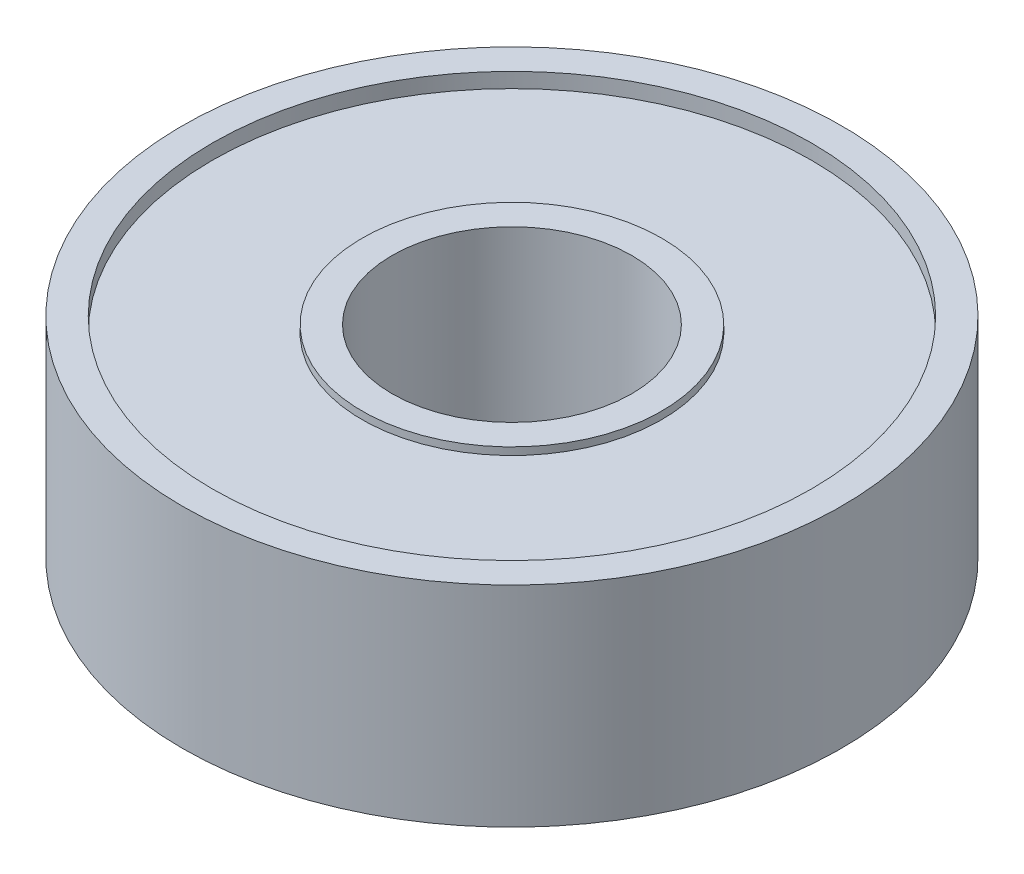
ISO-10303-21;
HEADER;
FILE_DESCRIPTION(('STEP AP214'),'2;1');
FILE_NAME('part.step','',(''),(''),'','','');
FILE_SCHEMA(('AUTOMOTIVE_DESIGN { 1 0 10303 214 1 1 1 1 }'));
ENDSEC;
DATA;
#1=APPLICATION_CONTEXT('core data for automotive mechanical design processes');
#2=APPLICATION_PROTOCOL_DEFINITION('international standard','automotive_design',2000,#1);
#3=PRODUCT_CONTEXT('',#1,'mechanical');
#4=PRODUCT('Part','Part','',(#3));
#5=PRODUCT_RELATED_PRODUCT_CATEGORY('part','',(#4));
#6=PRODUCT_DEFINITION_FORMATION('','',#4);
#7=PRODUCT_DEFINITION_CONTEXT('part definition',#1,'design');
#8=PRODUCT_DEFINITION('design','',#6,#7);
#9=PRODUCT_DEFINITION_SHAPE('','',#8);
#10=(LENGTH_UNIT() NAMED_UNIT(*) SI_UNIT(.MILLI.,.METRE.));
#11=(NAMED_UNIT(*) PLANE_ANGLE_UNIT() SI_UNIT($,.RADIAN.));
#12=(NAMED_UNIT(*) SI_UNIT($,.STERADIAN.) SOLID_ANGLE_UNIT());
#13=UNCERTAINTY_MEASURE_WITH_UNIT(LENGTH_MEASURE(1.E-05),#10,'distance_accuracy_value','');
#14=(GEOMETRIC_REPRESENTATION_CONTEXT(3) GLOBAL_UNCERTAINTY_ASSIGNED_CONTEXT((#13)) GLOBAL_UNIT_ASSIGNED_CONTEXT((#10,
#11,#12)) REPRESENTATION_CONTEXT('',''));
#15=CARTESIAN_POINT('',(0.,0.,0.));
#16=DIRECTION('',(0.,0.,1.));
#17=DIRECTION('',(1.,0.,0.));
#18=AXIS2_PLACEMENT_3D('',#15,#16,#17);
#19=CARTESIAN_POINT('',(0.,3.,0.));
#20=DIRECTION('',(0.,1.,0.));
#21=DIRECTION('',(0.,0.,1.));
#22=AXIS2_PLACEMENT_3D('',#19,#20,#21);
#23=PLANE('',#22);
#24=CARTESIAN_POINT('',(0.,3.,0.));
#25=DIRECTION('',(0.,1.,0.));
#26=DIRECTION('',(0.,0.,1.));
#27=AXIS2_PLACEMENT_3D('',#24,#25,#26);
#28=CIRCLE('',#27,10.);
#29=CARTESIAN_POINT('',(0.,3.,10.));
#30=VERTEX_POINT('',#29);
#31=EDGE_CURVE('E39',#30,#30,#28,.F.);
#32=ORIENTED_EDGE('',*,*,#31,.F.);
#33=EDGE_LOOP('',(#32));
#34=FACE_BOUND('',#33,.T.);
#35=CARTESIAN_POINT('',(0.,3.,0.));
#36=DIRECTION('',(0.,1.,0.));
#37=DIRECTION('',(0.,0.,1.));
#38=AXIS2_PLACEMENT_3D('',#35,#36,#37);
#39=CIRCLE('',#38,5.);
#40=CARTESIAN_POINT('',(0.,3.,-5.));
#41=VERTEX_POINT('',#40);
#42=EDGE_CURVE('E59',#41,#41,#39,.F.);
#43=ORIENTED_EDGE('',*,*,#42,.T.);
#44=EDGE_LOOP('',(#43));
#45=FACE_BOUND('',#44,.T.);
#46=ADVANCED_FACE('F32',(#34,#45),#23,.T.);
#47=CARTESIAN_POINT('',(0.,-3.,0.));
#48=DIRECTION('',(0.,1.,0.));
#49=DIRECTION('',(0.,0.,1.));
#50=AXIS2_PLACEMENT_3D('',#47,#48,#49);
#51=PLANE('',#50);
#52=CARTESIAN_POINT('',(0.,-3.,0.));
#53=DIRECTION('',(0.,1.,0.));
#54=DIRECTION('',(0.,0.,1.));
#55=AXIS2_PLACEMENT_3D('',#52,#53,#54);
#56=CIRCLE('',#55,10.);
#57=CARTESIAN_POINT('',(0.,-3.,10.));
#58=VERTEX_POINT('',#57);
#59=EDGE_CURVE('E43',#58,#58,#56,.F.);
#60=ORIENTED_EDGE('',*,*,#59,.T.);
#61=EDGE_LOOP('',(#60));
#62=FACE_BOUND('',#61,.T.);
#63=CARTESIAN_POINT('',(0.,-3.,0.));
#64=DIRECTION('',(0.,1.,0.));
#65=DIRECTION('',(0.,0.,1.));
#66=AXIS2_PLACEMENT_3D('',#63,#64,#65);
#67=CIRCLE('',#66,5.);
#68=CARTESIAN_POINT('',(0.,-3.,-5.));
#69=VERTEX_POINT('',#68);
#70=EDGE_CURVE('E10',#69,#69,#67,.F.);
#71=ORIENTED_EDGE('',*,*,#70,.F.);
#72=EDGE_LOOP('',(#71));
#73=FACE_BOUND('',#72,.T.);
#74=ADVANCED_FACE('F100',(#62,#73),#51,.F.);
#75=CARTESIAN_POINT('',(0.,3.5,0.));
#76=DIRECTION('',(0.,1.,0.));
#77=DIRECTION('',(0.,0.,1.));
#78=AXIS2_PLACEMENT_3D('',#75,#76,#77);
#79=PLANE('',#78);
#80=CARTESIAN_POINT('',(0.,3.5,0.));
#81=DIRECTION('',(0.,1.,0.));
#82=DIRECTION('',(0.,0.,1.));
#83=AXIS2_PLACEMENT_3D('',#80,#81,#82);
#84=CIRCLE('',#83,11.);
#85=CARTESIAN_POINT('',(0.,3.5,11.));
#86=VERTEX_POINT('',#85);
#87=EDGE_CURVE('E48',#86,#86,#84,.T.);
#88=ORIENTED_EDGE('',*,*,#87,.T.);
#89=EDGE_LOOP('',(#88));
#90=FACE_BOUND('',#89,.T.);
#91=CARTESIAN_POINT('',(0.,3.5,0.));
#92=DIRECTION('',(0.,1.,0.));
#93=DIRECTION('',(0.,0.,1.));
#94=AXIS2_PLACEMENT_3D('',#91,#92,#93);
#95=CIRCLE('',#94,10.);
#96=CARTESIAN_POINT('',(0.,3.5,10.));
#97=VERTEX_POINT('',#96);
#98=EDGE_CURVE('E53',#97,#97,#95,.T.);
#99=ORIENTED_EDGE('',*,*,#98,.F.);
#100=EDGE_LOOP('',(#99));
#101=FACE_BOUND('',#100,.T.);
#102=ADVANCED_FACE('F106',(#90,#101),#79,.T.);
#103=CARTESIAN_POINT('',(0.,3.5,0.));
#104=DIRECTION('',(0.,-1.,0.));
#105=DIRECTION('',(0.,0.,-1.));
#106=AXIS2_PLACEMENT_3D('',#103,#104,#105);
#107=CYLINDRICAL_SURFACE('',#106,10.);
#108=ORIENTED_EDGE('',*,*,#31,.T.);
#109=EDGE_LOOP('',(#108));
#110=FACE_BOUND('',#109,.T.);
#111=ORIENTED_EDGE('',*,*,#98,.T.);
#112=EDGE_LOOP('',(#111));
#113=FACE_BOUND('',#112,.T.);
#114=ADVANCED_FACE('F116',(#110,#113),#107,.F.);
#115=CARTESIAN_POINT('',(0.,3.,0.));
#116=DIRECTION('',(0.,-1.,0.));
#117=DIRECTION('',(0.,0.,-1.));
#118=AXIS2_PLACEMENT_3D('',#115,#116,#117);
#119=CYLINDRICAL_SURFACE('',#118,11.);
#120=CARTESIAN_POINT('',(0.,-3.5,0.));
#121=DIRECTION('',(0.,1.,0.));
#122=DIRECTION('',(0.,0.,1.));
#123=AXIS2_PLACEMENT_3D('',#120,#121,#122);
#124=CIRCLE('',#123,11.);
#125=CARTESIAN_POINT('',(0.,-3.5,11.));
#126=VERTEX_POINT('',#125);
#127=EDGE_CURVE('E50',#126,#126,#124,.T.);
#128=ORIENTED_EDGE('',*,*,#127,.T.);
#129=EDGE_LOOP('',(#128));
#130=FACE_BOUND('',#129,.T.);
#131=ORIENTED_EDGE('',*,*,#87,.F.);
#132=EDGE_LOOP('',(#131));
#133=FACE_BOUND('',#132,.T.);
#134=ADVANCED_FACE('F34',(#130,#133),#119,.T.);
#135=CARTESIAN_POINT('',(0.,-3.5,0.));
#136=DIRECTION('',(0.,1.,0.));
#137=DIRECTION('',(0.,0.,1.));
#138=AXIS2_PLACEMENT_3D('',#135,#136,#137);
#139=PLANE('',#138);
#140=ORIENTED_EDGE('',*,*,#127,.F.);
#141=EDGE_LOOP('',(#140));
#142=FACE_BOUND('',#141,.T.);
#143=CARTESIAN_POINT('',(0.,-3.5,0.));
#144=DIRECTION('',(0.,1.,0.));
#145=DIRECTION('',(0.,0.,1.));
#146=AXIS2_PLACEMENT_3D('',#143,#144,#145);
#147=CIRCLE('',#146,10.);
#148=CARTESIAN_POINT('',(0.,-3.5,10.));
#149=VERTEX_POINT('',#148);
#150=EDGE_CURVE('E56',#149,#149,#147,.T.);
#151=ORIENTED_EDGE('',*,*,#150,.T.);
#152=EDGE_LOOP('',(#151));
#153=FACE_BOUND('',#152,.T.);
#154=ADVANCED_FACE('F110',(#142,#153),#139,.F.);
#155=ORIENTED_EDGE('',*,*,#150,.F.);
#156=EDGE_LOOP('',(#155));
#157=FACE_BOUND('',#156,.T.);
#158=ORIENTED_EDGE('',*,*,#59,.F.);
#159=EDGE_LOOP('',(#158));
#160=FACE_BOUND('',#159,.T.);
#161=ADVANCED_FACE('F113',(#157,#160),#107,.F.);
#162=CARTESIAN_POINT('',(0.,-3.25,0.));
#163=DIRECTION('',(0.,1.,0.));
#164=DIRECTION('',(0.,0.,1.));
#165=AXIS2_PLACEMENT_3D('',#162,#163,#164);
#166=PLANE('',#165);
#167=CARTESIAN_POINT('',(0.,-3.25,0.));
#168=DIRECTION('',(0.,1.,0.));
#169=DIRECTION('',(0.,0.,1.));
#170=AXIS2_PLACEMENT_3D('',#167,#168,#169);
#171=CIRCLE('',#170,4.);
#172=CARTESIAN_POINT('',(0.,-3.25,4.));
#173=VERTEX_POINT('',#172);
#174=EDGE_CURVE('E68',#173,#173,#171,.T.);
#175=ORIENTED_EDGE('',*,*,#174,.T.);
#176=EDGE_LOOP('',(#175));
#177=FACE_BOUND('',#176,.T.);
#178=CARTESIAN_POINT('',(0.,-3.25,0.));
#179=DIRECTION('',(0.,1.,0.));
#180=DIRECTION('',(0.,0.,1.));
#181=AXIS2_PLACEMENT_3D('',#178,#179,#180);
#182=CIRCLE('',#181,5.);
#183=CARTESIAN_POINT('',(0.,-3.25,-5.));
#184=VERTEX_POINT('',#183);
#185=EDGE_CURVE('E65',#184,#184,#182,.T.);
#186=ORIENTED_EDGE('',*,*,#185,.F.);
#187=EDGE_LOOP('',(#186));
#188=FACE_BOUND('',#187,.T.);
#189=ADVANCED_FACE('F94',(#177,#188),#166,.F.);
#190=CARTESIAN_POINT('',(0.,3.25,0.));
#191=DIRECTION('',(0.,-1.,0.));
#192=DIRECTION('',(0.,0.,-1.));
#193=AXIS2_PLACEMENT_3D('',#190,#191,#192);
#194=CYLINDRICAL_SURFACE('',#193,5.);
#195=CARTESIAN_POINT('',(0.,-3.25,-5.));
#196=CARTESIAN_POINT('',(0.,-3.24739583333333,-5.));
#197=CARTESIAN_POINT('',(0.,-3.24479166666667,-5.));
#198=CARTESIAN_POINT('',(0.,-3.23958333333333,-5.));
#199=CARTESIAN_POINT('',(0.,-3.23697916666667,-5.));
#200=CARTESIAN_POINT('',(0.,-3.23177083333333,-5.));
#201=CARTESIAN_POINT('',(0.,-3.22916666666667,-5.));
#202=CARTESIAN_POINT('',(0.,-3.22395833333333,-5.));
#203=CARTESIAN_POINT('',(0.,-3.22135416666667,-5.));
#204=CARTESIAN_POINT('',(0.,-3.21614583333333,-5.));
#205=CARTESIAN_POINT('',(0.,-3.21354166666667,-5.));
#206=CARTESIAN_POINT('',(0.,-3.20833333333333,-5.));
#207=CARTESIAN_POINT('',(0.,-3.20572916666667,-5.));
#208=CARTESIAN_POINT('',(0.,-3.20052083333333,-5.));
#209=CARTESIAN_POINT('',(0.,-3.19791666666667,-5.));
#210=CARTESIAN_POINT('',(0.,-3.19270833333333,-5.));
#211=CARTESIAN_POINT('',(0.,-3.19010416666667,-5.));
#212=CARTESIAN_POINT('',(0.,-3.18489583333333,-5.));
#213=CARTESIAN_POINT('',(0.,-3.18229166666667,-5.));
#214=CARTESIAN_POINT('',(0.,-3.17708333333333,-5.));
#215=CARTESIAN_POINT('',(0.,-3.17447916666667,-5.));
#216=CARTESIAN_POINT('',(0.,-3.16927083333333,-5.));
#217=CARTESIAN_POINT('',(0.,-3.16666666666667,-5.));
#218=CARTESIAN_POINT('',(0.,-3.16145833333333,-5.));
#219=CARTESIAN_POINT('',(0.,-3.15885416666667,-5.));
#220=CARTESIAN_POINT('',(0.,-3.15364583333333,-5.));
#221=CARTESIAN_POINT('',(0.,-3.15104166666667,-5.));
#222=CARTESIAN_POINT('',(0.,-3.14583333333333,-5.));
#223=CARTESIAN_POINT('',(0.,-3.14322916666667,-5.));
#224=CARTESIAN_POINT('',(0.,-3.13802083333333,-5.));
#225=CARTESIAN_POINT('',(0.,-3.13541666666667,-5.));
#226=CARTESIAN_POINT('',(0.,-3.13020833333333,-5.));
#227=CARTESIAN_POINT('',(0.,-3.12760416666667,-5.));
#228=CARTESIAN_POINT('',(0.,-3.12239583333333,-5.));
#229=CARTESIAN_POINT('',(0.,-3.11979166666667,-5.));
#230=CARTESIAN_POINT('',(0.,-3.11458333333333,-5.));
#231=CARTESIAN_POINT('',(0.,-3.11197916666667,-5.));
#232=CARTESIAN_POINT('',(0.,-3.10677083333333,-5.));
#233=CARTESIAN_POINT('',(0.,-3.10416666666667,-5.));
#234=CARTESIAN_POINT('',(0.,-3.09895833333333,-5.));
#235=CARTESIAN_POINT('',(0.,-3.09635416666667,-5.));
#236=CARTESIAN_POINT('',(0.,-3.09114583333333,-5.));
#237=CARTESIAN_POINT('',(0.,-3.08854166666667,-5.));
#238=CARTESIAN_POINT('',(0.,-3.08333333333333,-5.));
#239=CARTESIAN_POINT('',(0.,-3.08072916666667,-5.));
#240=CARTESIAN_POINT('',(0.,-3.07552083333333,-5.));
#241=CARTESIAN_POINT('',(0.,-3.07291666666667,-5.));
#242=CARTESIAN_POINT('',(0.,-3.06770833333333,-5.));
#243=CARTESIAN_POINT('',(0.,-3.06510416666667,-5.));
#244=CARTESIAN_POINT('',(0.,-3.05989583333333,-5.));
#245=CARTESIAN_POINT('',(0.,-3.05729166666667,-5.));
#246=CARTESIAN_POINT('',(0.,-3.05208333333333,-5.));
#247=CARTESIAN_POINT('',(0.,-3.04947916666667,-5.));
#248=CARTESIAN_POINT('',(0.,-3.04427083333333,-5.));
#249=CARTESIAN_POINT('',(0.,-3.04166666666667,-5.));
#250=CARTESIAN_POINT('',(0.,-3.03645833333333,-5.));
#251=CARTESIAN_POINT('',(0.,-3.03385416666667,-5.));
#252=CARTESIAN_POINT('',(0.,-3.02864583333333,-5.));
#253=CARTESIAN_POINT('',(0.,-3.02604166666667,-5.));
#254=CARTESIAN_POINT('',(0.,-3.02083333333333,-5.));
#255=CARTESIAN_POINT('',(0.,-3.01822916666667,-5.));
#256=CARTESIAN_POINT('',(0.,-3.01302083333333,-5.));
#257=CARTESIAN_POINT('',(0.,-3.01041666666667,-5.));
#258=CARTESIAN_POINT('',(0.,-3.00520833333333,-5.));
#259=CARTESIAN_POINT('',(0.,-3.00260416666667,-5.));
#260=CARTESIAN_POINT('',(0.,-3.,-5.));
#261=B_SPLINE_CURVE_WITH_KNOTS('',3,(#195,#196,#197,#198,#199,#200,#201,#202,#203,#204,#205,
#206,#207,#208,#209,#210,#211,#212,#213,#214,#215,#216,#217,#218,#219,#220,#221,#222,#223,#224,
#225,#226,#227,#228,#229,#230,#231,#232,#233,#234,#235,#236,#237,#238,#239,#240,#241,#242,#243,
#244,#245,#246,#247,#248,#249,#250,#251,#252,#253,#254,#255,#256,#257,#258,#259,#260),
.UNSPECIFIED.,.F.,.F.,(4,2,2,2,2,2,2,2,2,2,2,2,2,2,2,2,2,2,2,2,2,2,2,2,2,2,2,2,2,2,2,2,4),(0.,
0.00781250000000001,0.015625,0.0234375,0.03125,0.0390625,0.046875,0.0546875,0.0625000000000001,
0.0703124999999992,0.0781249999999992,0.0859374999999992,0.0937499999999992,0.101562499999999,
0.109374999999999,0.117187499999999,0.124999999999999,0.132812499999999,0.140624999999999,
0.148437499999999,0.156249999999999,0.164062499999999,0.171874999999999,0.179687499999999,
0.187499999999998,0.195312499999998,0.203124999999998,0.210937499999998,0.218749999999998,
0.226562499999998,0.234374999999998,0.242187499999998,0.249999999999999),.UNSPECIFIED.);
#262=EDGE_CURVE('BSEAM88',#184,#69,#261,.T.);
#263=ORIENTED_EDGE('',*,*,#185,.T.);
#264=ORIENTED_EDGE('',*,*,#70,.T.);
#265=ORIENTED_EDGE('',*,*,#262,.T.);
#266=ORIENTED_EDGE('',*,*,#262,.F.);
#267=EDGE_LOOP('',(#263,#265,#264,#266));
#268=FACE_BOUND('',#267,.T.);
#269=ADVANCED_FACE('F88',(#268),#194,.T.);
#270=CARTESIAN_POINT('',(0.,3.25,0.));
#271=DIRECTION('',(0.,1.,0.));
#272=DIRECTION('',(0.,0.,1.));
#273=AXIS2_PLACEMENT_3D('',#270,#271,#272);
#274=CIRCLE('',#273,5.);
#275=CARTESIAN_POINT('',(0.,3.25,-5.));
#276=VERTEX_POINT('',#275);
#277=EDGE_CURVE('E64',#276,#276,#274,.T.);
#278=CARTESIAN_POINT('',(0.,3.,-5.));
#279=CARTESIAN_POINT('',(0.,3.00260416666667,-5.));
#280=CARTESIAN_POINT('',(0.,3.00520833333333,-5.));
#281=CARTESIAN_POINT('',(0.,3.01041666666667,-5.));
#282=CARTESIAN_POINT('',(0.,3.01302083333333,-5.));
#283=CARTESIAN_POINT('',(0.,3.01822916666667,-5.));
#284=CARTESIAN_POINT('',(0.,3.02083333333333,-5.));
#285=CARTESIAN_POINT('',(0.,3.02604166666667,-5.));
#286=CARTESIAN_POINT('',(0.,3.02864583333333,-5.));
#287=CARTESIAN_POINT('',(0.,3.03385416666667,-5.));
#288=CARTESIAN_POINT('',(0.,3.03645833333333,-5.));
#289=CARTESIAN_POINT('',(0.,3.04166666666667,-5.));
#290=CARTESIAN_POINT('',(0.,3.04427083333333,-5.));
#291=CARTESIAN_POINT('',(0.,3.04947916666667,-5.));
#292=CARTESIAN_POINT('',(0.,3.05208333333333,-5.));
#293=CARTESIAN_POINT('',(0.,3.05729166666667,-5.));
#294=CARTESIAN_POINT('',(0.,3.05989583333333,-5.));
#295=CARTESIAN_POINT('',(0.,3.06510416666667,-5.));
#296=CARTESIAN_POINT('',(0.,3.06770833333333,-5.));
#297=CARTESIAN_POINT('',(0.,3.07291666666667,-5.));
#298=CARTESIAN_POINT('',(0.,3.07552083333333,-5.));
#299=CARTESIAN_POINT('',(0.,3.08072916666667,-5.));
#300=CARTESIAN_POINT('',(0.,3.08333333333333,-5.));
#301=CARTESIAN_POINT('',(0.,3.08854166666667,-5.));
#302=CARTESIAN_POINT('',(0.,3.09114583333333,-5.));
#303=CARTESIAN_POINT('',(0.,3.09635416666667,-5.));
#304=CARTESIAN_POINT('',(0.,3.09895833333333,-5.));
#305=CARTESIAN_POINT('',(0.,3.10416666666667,-5.));
#306=CARTESIAN_POINT('',(0.,3.10677083333333,-5.));
#307=CARTESIAN_POINT('',(0.,3.11197916666667,-5.));
#308=CARTESIAN_POINT('',(0.,3.11458333333333,-5.));
#309=CARTESIAN_POINT('',(0.,3.11979166666667,-5.));
#310=CARTESIAN_POINT('',(0.,3.12239583333333,-5.));
#311=CARTESIAN_POINT('',(0.,3.12760416666667,-5.));
#312=CARTESIAN_POINT('',(0.,3.13020833333333,-5.));
#313=CARTESIAN_POINT('',(0.,3.13541666666667,-5.));
#314=CARTESIAN_POINT('',(0.,3.13802083333333,-5.));
#315=CARTESIAN_POINT('',(0.,3.14322916666667,-5.));
#316=CARTESIAN_POINT('',(0.,3.14583333333333,-5.));
#317=CARTESIAN_POINT('',(0.,3.15104166666667,-5.));
#318=CARTESIAN_POINT('',(0.,3.15364583333333,-5.));
#319=CARTESIAN_POINT('',(0.,3.15885416666667,-5.));
#320=CARTESIAN_POINT('',(0.,3.16145833333333,-5.));
#321=CARTESIAN_POINT('',(0.,3.16666666666667,-5.));
#322=CARTESIAN_POINT('',(0.,3.16927083333333,-5.));
#323=CARTESIAN_POINT('',(0.,3.17447916666667,-5.));
#324=CARTESIAN_POINT('',(0.,3.17708333333333,-5.));
#325=CARTESIAN_POINT('',(0.,3.18229166666667,-5.));
#326=CARTESIAN_POINT('',(0.,3.18489583333333,-5.));
#327=CARTESIAN_POINT('',(0.,3.19010416666667,-5.));
#328=CARTESIAN_POINT('',(0.,3.19270833333333,-5.));
#329=CARTESIAN_POINT('',(0.,3.19791666666667,-5.));
#330=CARTESIAN_POINT('',(0.,3.20052083333333,-5.));
#331=CARTESIAN_POINT('',(0.,3.20572916666667,-5.));
#332=CARTESIAN_POINT('',(0.,3.20833333333333,-5.));
#333=CARTESIAN_POINT('',(0.,3.21354166666667,-5.));
#334=CARTESIAN_POINT('',(0.,3.21614583333333,-5.));
#335=CARTESIAN_POINT('',(0.,3.22135416666667,-5.));
#336=CARTESIAN_POINT('',(0.,3.22395833333333,-5.));
#337=CARTESIAN_POINT('',(0.,3.22916666666667,-5.));
#338=CARTESIAN_POINT('',(0.,3.23177083333333,-5.));
#339=CARTESIAN_POINT('',(0.,3.23697916666667,-5.));
#340=CARTESIAN_POINT('',(0.,3.23958333333333,-5.));
#341=CARTESIAN_POINT('',(0.,3.24479166666667,-5.));
#342=CARTESIAN_POINT('',(0.,3.24739583333333,-5.));
#343=CARTESIAN_POINT('',(0.,3.25,-5.));
#344=B_SPLINE_CURVE_WITH_KNOTS('',3,(#278,#279,#280,#281,#282,#283,#284,#285,#286,#287,#288,
#289,#290,#291,#292,#293,#294,#295,#296,#297,#298,#299,#300,#301,#302,#303,#304,#305,#306,#307,
#308,#309,#310,#311,#312,#313,#314,#315,#316,#317,#318,#319,#320,#321,#322,#323,#324,#325,#326,
#327,#328,#329,#330,#331,#332,#333,#334,#335,#336,#337,#338,#339,#340,#341,#342,#343),
.UNSPECIFIED.,.F.,.F.,(4,2,2,2,2,2,2,2,2,2,2,2,2,2,2,2,2,2,2,2,2,2,2,2,2,2,2,2,2,2,2,2,4),(0.,
0.00781250000000001,0.015625,0.0234375,0.03125,0.0390625,0.046875,0.0546875,0.0625000000000001,
0.0703125000000001,0.0781250000000001,0.0859375000000001,0.0937500000000001,0.1015625,0.109375,
0.1171875,0.125,0.1328125,0.140625,0.1484375,0.15625,0.1640625,0.171875,0.1796875,0.1875,
0.1953125,0.203125,0.2109375,0.21875,0.2265625,0.234375,0.2421875,0.25),.UNSPECIFIED.);
#345=EDGE_CURVE('BSEAM83',#41,#276,#344,.T.);
#346=ORIENTED_EDGE('',*,*,#42,.F.);
#347=ORIENTED_EDGE('',*,*,#277,.F.);
#348=ORIENTED_EDGE('',*,*,#345,.T.);
#349=ORIENTED_EDGE('',*,*,#345,.F.);
#350=EDGE_LOOP('',(#346,#348,#347,#349));
#351=FACE_BOUND('',#350,.T.);
#352=ADVANCED_FACE('F83',(#351),#194,.T.);
#353=CARTESIAN_POINT('',(0.,3.25,0.));
#354=DIRECTION('',(0.,1.,0.));
#355=DIRECTION('',(0.,0.,1.));
#356=AXIS2_PLACEMENT_3D('',#353,#354,#355);
#357=PLANE('',#356);
#358=CARTESIAN_POINT('',(0.,3.25,0.));
#359=DIRECTION('',(0.,1.,0.));
#360=DIRECTION('',(0.,0.,1.));
#361=AXIS2_PLACEMENT_3D('',#358,#359,#360);
#362=CIRCLE('',#361,4.);
#363=CARTESIAN_POINT('',(0.,3.25,4.));
#364=VERTEX_POINT('',#363);
#365=EDGE_CURVE('E73',#364,#364,#362,.T.);
#366=ORIENTED_EDGE('',*,*,#365,.F.);
#367=EDGE_LOOP('',(#366));
#368=FACE_BOUND('',#367,.T.);
#369=ORIENTED_EDGE('',*,*,#277,.T.);
#370=EDGE_LOOP('',(#369));
#371=FACE_BOUND('',#370,.T.);
#372=ADVANCED_FACE('F80',(#368,#371),#357,.T.);
#373=CARTESIAN_POINT('',(0.,-6.75,0.));
#374=DIRECTION('',(0.,1.,0.));
#375=DIRECTION('',(0.,0.,1.));
#376=AXIS2_PLACEMENT_3D('',#373,#374,#375);
#377=CYLINDRICAL_SURFACE('',#376,4.);
#378=ORIENTED_EDGE('',*,*,#365,.T.);
#379=EDGE_LOOP('',(#378));
#380=FACE_BOUND('',#379,.T.);
#381=ORIENTED_EDGE('',*,*,#174,.F.);
#382=EDGE_LOOP('',(#381));
#383=FACE_BOUND('',#382,.T.);
#384=ADVANCED_FACE('F77',(#380,#383),#377,.F.);
#385=CLOSED_SHELL('',(#46,#74,#102,#114,#134,#154,#161,#189,#269,#352,#372,#384));
#386=MANIFOLD_SOLID_BREP('B2',#385);
#387=ADVANCED_BREP_SHAPE_REPRESENTATION('',(#18,#386),#14);
#388=SHAPE_DEFINITION_REPRESENTATION(#9,#387);
ENDSEC;
END-ISO-10303-21;
